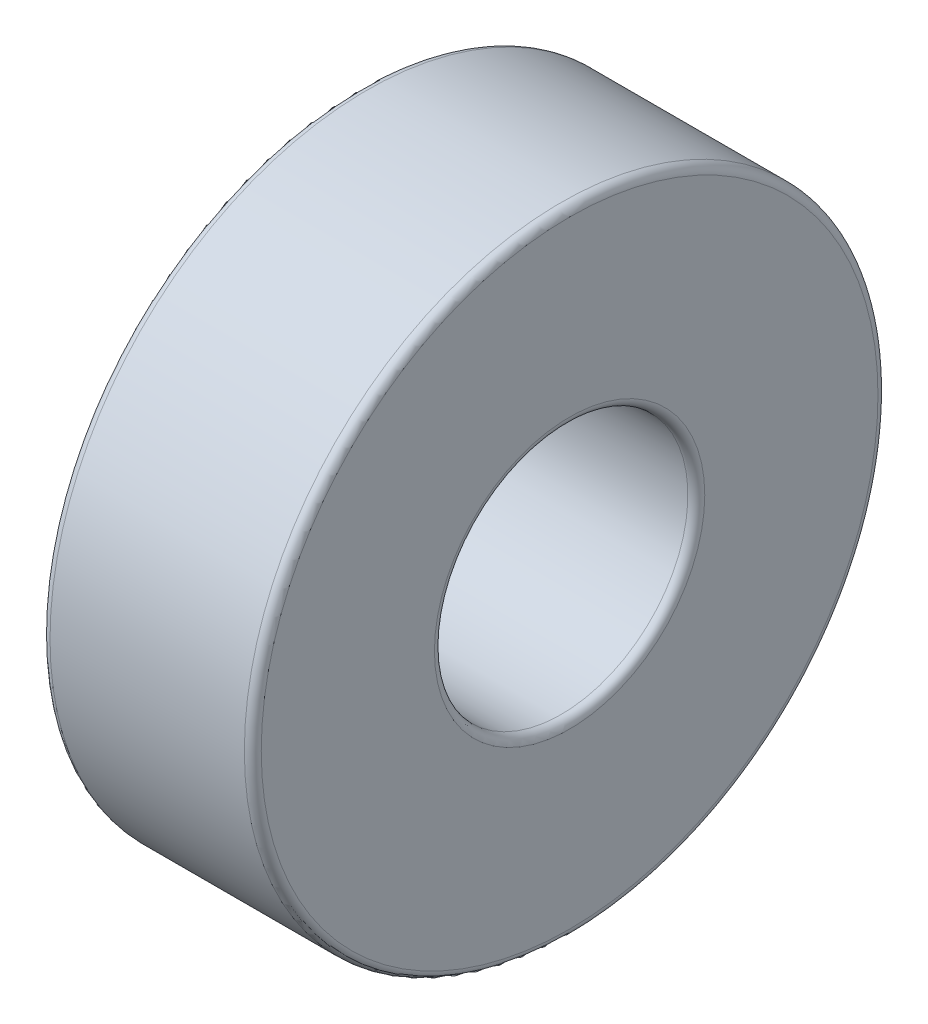
ISO-10303-21;
HEADER;
FILE_DESCRIPTION(('STEP AP214'),'2;1');
FILE_NAME('part.step','',(''),(''),'','','');
FILE_SCHEMA(('AUTOMOTIVE_DESIGN { 1 0 10303 214 1 1 1 1 }'));
ENDSEC;
DATA;
#1=APPLICATION_CONTEXT('core data for automotive mechanical design processes');
#2=APPLICATION_PROTOCOL_DEFINITION('international standard','automotive_design',2000,#1);
#3=PRODUCT_CONTEXT('',#1,'mechanical');
#4=PRODUCT('Part','Part','',(#3));
#5=PRODUCT_RELATED_PRODUCT_CATEGORY('part','',(#4));
#6=PRODUCT_DEFINITION_FORMATION('','',#4);
#7=PRODUCT_DEFINITION_CONTEXT('part definition',#1,'design');
#8=PRODUCT_DEFINITION('design','',#6,#7);
#9=PRODUCT_DEFINITION_SHAPE('','',#8);
#10=(LENGTH_UNIT() NAMED_UNIT(*) SI_UNIT(.MILLI.,.METRE.));
#11=(NAMED_UNIT(*) PLANE_ANGLE_UNIT() SI_UNIT($,.RADIAN.));
#12=(NAMED_UNIT(*) SI_UNIT($,.STERADIAN.) SOLID_ANGLE_UNIT());
#13=UNCERTAINTY_MEASURE_WITH_UNIT(LENGTH_MEASURE(1.E-05),#10,'distance_accuracy_value','');
#14=(GEOMETRIC_REPRESENTATION_CONTEXT(3) GLOBAL_UNCERTAINTY_ASSIGNED_CONTEXT((#13)) GLOBAL_UNIT_ASSIGNED_CONTEXT((#10,
#11,#12)) REPRESENTATION_CONTEXT('',''));
#15=CARTESIAN_POINT('',(0.,0.,0.));
#16=DIRECTION('',(0.,0.,1.));
#17=DIRECTION('',(1.,0.,0.));
#18=AXIS2_PLACEMENT_3D('',#15,#16,#17);
#19=CARTESIAN_POINT('',(0.2,0.,0.));
#20=DIRECTION('',(-1.,0.,0.));
#21=DIRECTION('',(0.,0.,1.));
#22=AXIS2_PLACEMENT_3D('',#19,#20,#21);
#23=CYLINDRICAL_SURFACE('',#22,3.);
#24=CARTESIAN_POINT('',(4.8,0.,0.));
#25=DIRECTION('',(-1.,0.,0.));
#26=DIRECTION('',(0.,0.,1.));
#27=AXIS2_PLACEMENT_3D('',#24,#25,#26);
#28=CIRCLE('',#27,3.);
#29=CARTESIAN_POINT('',(4.8,0.,3.));
#30=VERTEX_POINT('',#29);
#31=EDGE_CURVE('E9',#30,#30,#28,.T.);
#32=ORIENTED_EDGE('',*,*,#31,.F.);
#33=EDGE_LOOP('',(#32));
#34=FACE_BOUND('',#33,.T.);
#35=CARTESIAN_POINT('',(0.2,0.,0.));
#36=DIRECTION('',(-1.,0.,0.));
#37=DIRECTION('',(0.,0.,1.));
#38=AXIS2_PLACEMENT_3D('',#35,#36,#37);
#39=CIRCLE('',#38,3.);
#40=CARTESIAN_POINT('',(0.2,0.,3.));
#41=VERTEX_POINT('',#40);
#42=EDGE_CURVE('E83',#41,#41,#39,.T.);
#43=ORIENTED_EDGE('',*,*,#42,.T.);
#44=EDGE_LOOP('',(#43));
#45=FACE_BOUND('',#44,.T.);
#46=ADVANCED_FACE('F14',(#34,#45),#23,.F.);
#47=CARTESIAN_POINT('',(4.8,0.,0.));
#48=DIRECTION('',(-1.,0.,0.));
#49=DIRECTION('',(0.,0.,1.));
#50=AXIS2_PLACEMENT_3D('',#47,#48,#49);
#51=TOROIDAL_SURFACE('',#50,3.2,0.2);
#52=CARTESIAN_POINT('',(5.,0.,0.));
#53=DIRECTION('',(-1.,0.,0.));
#54=DIRECTION('',(0.,0.,1.));
#55=AXIS2_PLACEMENT_3D('',#52,#53,#54);
#56=CIRCLE('',#55,3.2);
#57=CARTESIAN_POINT('',(5.,0.,3.2));
#58=VERTEX_POINT('',#57);
#59=EDGE_CURVE('E23',#58,#58,#56,.T.);
#60=ORIENTED_EDGE('',*,*,#59,.F.);
#61=EDGE_LOOP('',(#60));
#62=FACE_BOUND('',#61,.T.);
#63=ORIENTED_EDGE('',*,*,#31,.T.);
#64=EDGE_LOOP('',(#63));
#65=FACE_BOUND('',#64,.T.);
#66=ADVANCED_FACE('F113',(#62,#65),#51,.T.);
#67=CARTESIAN_POINT('',(5.,3.2,0.));
#68=DIRECTION('',(-1.,0.,0.));
#69=DIRECTION('',(0.,0.,1.));
#70=AXIS2_PLACEMENT_3D('',#67,#68,#69);
#71=PLANE('',#70);
#72=CARTESIAN_POINT('',(5.,0.,0.));
#73=DIRECTION('',(-1.,0.,0.));
#74=DIRECTION('',(0.,0.,1.));
#75=AXIS2_PLACEMENT_3D('',#72,#73,#74);
#76=CIRCLE('',#75,7.3);
#77=CARTESIAN_POINT('',(5.,0.,7.3));
#78=VERTEX_POINT('',#77);
#79=EDGE_CURVE('E33',#78,#78,#76,.T.);
#80=ORIENTED_EDGE('',*,*,#79,.F.);
#81=EDGE_LOOP('',(#80));
#82=FACE_BOUND('',#81,.T.);
#83=ORIENTED_EDGE('',*,*,#59,.T.);
#84=EDGE_LOOP('',(#83));
#85=FACE_BOUND('',#84,.T.);
#86=ADVANCED_FACE('F110',(#82,#85),#71,.F.);
#87=CARTESIAN_POINT('',(4.8,0.,0.));
#88=DIRECTION('',(-1.,0.,0.));
#89=DIRECTION('',(0.,0.,1.));
#90=AXIS2_PLACEMENT_3D('',#87,#88,#89);
#91=TOROIDAL_SURFACE('',#90,7.3,0.2);
#92=CARTESIAN_POINT('',(4.8,0.,0.));
#93=DIRECTION('',(-1.,0.,0.));
#94=DIRECTION('',(0.,0.,1.));
#95=AXIS2_PLACEMENT_3D('',#92,#93,#94);
#96=CIRCLE('',#95,7.5);
#97=CARTESIAN_POINT('',(4.8,0.,7.5));
#98=VERTEX_POINT('',#97);
#99=EDGE_CURVE('E98',#98,#98,#96,.T.);
#100=ORIENTED_EDGE('',*,*,#99,.F.);
#101=EDGE_LOOP('',(#100));
#102=FACE_BOUND('',#101,.T.);
#103=ORIENTED_EDGE('',*,*,#79,.T.);
#104=EDGE_LOOP('',(#103));
#105=FACE_BOUND('',#104,.T.);
#106=ADVANCED_FACE('F108',(#102,#105),#91,.T.);
#107=CARTESIAN_POINT('',(0.2,0.,0.));
#108=DIRECTION('',(-1.,0.,0.));
#109=DIRECTION('',(0.,0.,1.));
#110=AXIS2_PLACEMENT_3D('',#107,#108,#109);
#111=CYLINDRICAL_SURFACE('',#110,7.5);
#112=CARTESIAN_POINT('',(0.2,0.,0.));
#113=DIRECTION('',(-1.,0.,0.));
#114=DIRECTION('',(0.,0.,1.));
#115=AXIS2_PLACEMENT_3D('',#112,#113,#114);
#116=CIRCLE('',#115,7.5);
#117=CARTESIAN_POINT('',(0.2,0.,7.5));
#118=VERTEX_POINT('',#117);
#119=EDGE_CURVE('E94',#118,#118,#116,.T.);
#120=ORIENTED_EDGE('',*,*,#119,.F.);
#121=EDGE_LOOP('',(#120));
#122=FACE_BOUND('',#121,.T.);
#123=ORIENTED_EDGE('',*,*,#99,.T.);
#124=EDGE_LOOP('',(#123));
#125=FACE_BOUND('',#124,.T.);
#126=ADVANCED_FACE('F126',(#122,#125),#111,.T.);
#127=CARTESIAN_POINT('',(0.2,0.,0.));
#128=DIRECTION('',(-1.,0.,0.));
#129=DIRECTION('',(0.,0.,1.));
#130=AXIS2_PLACEMENT_3D('',#127,#128,#129);
#131=TOROIDAL_SURFACE('',#130,7.3,0.2);
#132=CARTESIAN_POINT('',(0.,0.,0.));
#133=DIRECTION('',(-1.,0.,0.));
#134=DIRECTION('',(0.,0.,1.));
#135=AXIS2_PLACEMENT_3D('',#132,#133,#134);
#136=CIRCLE('',#135,7.3);
#137=CARTESIAN_POINT('',(0.,0.,7.3));
#138=VERTEX_POINT('',#137);
#139=EDGE_CURVE('E90',#138,#138,#136,.T.);
#140=ORIENTED_EDGE('',*,*,#139,.F.);
#141=EDGE_LOOP('',(#140));
#142=FACE_BOUND('',#141,.T.);
#143=ORIENTED_EDGE('',*,*,#119,.T.);
#144=EDGE_LOOP('',(#143));
#145=FACE_BOUND('',#144,.T.);
#146=ADVANCED_FACE('F130',(#142,#145),#131,.T.);
#147=CARTESIAN_POINT('',(0.,3.2,0.));
#148=DIRECTION('',(-1.,0.,0.));
#149=DIRECTION('',(0.,0.,1.));
#150=AXIS2_PLACEMENT_3D('',#147,#148,#149);
#151=PLANE('',#150);
#152=ORIENTED_EDGE('',*,*,#139,.T.);
#153=EDGE_LOOP('',(#152));
#154=FACE_BOUND('',#153,.T.);
#155=CARTESIAN_POINT('',(0.,0.,0.));
#156=DIRECTION('',(-1.,0.,0.));
#157=DIRECTION('',(0.,0.,1.));
#158=AXIS2_PLACEMENT_3D('',#155,#156,#157);
#159=CIRCLE('',#158,3.2);
#160=CARTESIAN_POINT('',(0.,0.,3.2));
#161=VERTEX_POINT('',#160);
#162=EDGE_CURVE('E86',#161,#161,#159,.T.);
#163=ORIENTED_EDGE('',*,*,#162,.F.);
#164=EDGE_LOOP('',(#163));
#165=FACE_BOUND('',#164,.T.);
#166=ADVANCED_FACE('F134',(#154,#165),#151,.T.);
#167=CARTESIAN_POINT('',(0.2,0.,0.));
#168=DIRECTION('',(-1.,0.,0.));
#169=DIRECTION('',(0.,0.,1.));
#170=AXIS2_PLACEMENT_3D('',#167,#168,#169);
#171=TOROIDAL_SURFACE('',#170,3.2,0.2);
#172=ORIENTED_EDGE('',*,*,#42,.F.);
#173=EDGE_LOOP('',(#172));
#174=FACE_BOUND('',#173,.T.);
#175=ORIENTED_EDGE('',*,*,#162,.T.);
#176=EDGE_LOOP('',(#175));
#177=FACE_BOUND('',#176,.T.);
#178=ADVANCED_FACE('F138',(#174,#177),#171,.T.);
#179=CLOSED_SHELL('',(#46,#66,#86,#106,#126,#146,#166,#178));
#180=CARTESIAN_POINT('',(0.9375,0.,0.));
#181=DIRECTION('',(-1.,0.,0.));
#182=DIRECTION('',(0.,0.,-1.));
#183=AXIS2_PLACEMENT_3D('',#180,#181,#182);
#184=CYLINDRICAL_SURFACE('',#183,5.16);
#185=CARTESIAN_POINT('',(2.41,0.,0.));
#186=DIRECTION('',(-1.,0.,0.));
#187=DIRECTION('',(0.,-1.,0.));
#188=AXIS2_PLACEMENT_3D('',#185,#186,#187);
#189=CIRCLE('',#188,5.16);
#190=CARTESIAN_POINT('',(2.41,-5.16,0.));
#191=VERTEX_POINT('',#190);
#192=EDGE_CURVE('E63',#191,#191,#189,.T.);
#193=ORIENTED_EDGE('',*,*,#192,.T.);
#194=EDGE_LOOP('',(#193));
#195=FACE_BOUND('',#194,.T.);
#196=CARTESIAN_POINT('',(0.9375,0.,0.));
#197=DIRECTION('',(-1.,0.,0.));
#198=DIRECTION('',(0.,0.,-1.));
#199=AXIS2_PLACEMENT_3D('',#196,#197,#198);
#200=CIRCLE('',#199,5.16);
#201=CARTESIAN_POINT('',(0.9375,0.,-5.16));
#202=VERTEX_POINT('',#201);
#203=EDGE_CURVE('E79',#202,#202,#200,.T.);
#204=ORIENTED_EDGE('',*,*,#203,.F.);
#205=EDGE_LOOP('',(#204));
#206=FACE_BOUND('',#205,.T.);
#207=ADVANCED_FACE('F149',(#195,#206),#184,.T.);
#208=CARTESIAN_POINT('',(0.9375,0.,0.));
#209=DIRECTION('',(-1.,0.,0.));
#210=DIRECTION('',(0.,0.,-1.));
#211=AXIS2_PLACEMENT_3D('',#208,#209,#210);
#212=CYLINDRICAL_SURFACE('',#211,5.34);
#213=CARTESIAN_POINT('',(2.41,0.,0.));
#214=DIRECTION('',(-1.,0.,0.));
#215=DIRECTION('',(0.,-1.,0.));
#216=AXIS2_PLACEMENT_3D('',#213,#214,#215);
#217=CIRCLE('',#216,5.34);
#218=CARTESIAN_POINT('',(2.41,-5.34,0.));
#219=VERTEX_POINT('',#218);
#220=EDGE_CURVE('E17',#219,#219,#217,.F.);
#221=ORIENTED_EDGE('',*,*,#220,.T.);
#222=EDGE_LOOP('',(#221));
#223=FACE_BOUND('',#222,.T.);
#224=CARTESIAN_POINT('',(0.9375,0.,0.));
#225=DIRECTION('',(-1.,0.,0.));
#226=DIRECTION('',(0.,0.,-1.));
#227=AXIS2_PLACEMENT_3D('',#224,#225,#226);
#228=CIRCLE('',#227,5.34);
#229=CARTESIAN_POINT('',(0.9375,0.,-5.34));
#230=VERTEX_POINT('',#229);
#231=EDGE_CURVE('E75',#230,#230,#228,.T.);
#232=ORIENTED_EDGE('',*,*,#231,.T.);
#233=EDGE_LOOP('',(#232));
#234=FACE_BOUND('',#233,.T.);
#235=ADVANCED_FACE('F155',(#223,#234),#212,.F.);
#236=CARTESIAN_POINT('',(0.9375,-5.16,0.));
#237=DIRECTION('',(-1.,0.,0.));
#238=DIRECTION('',(0.,0.,-1.));
#239=AXIS2_PLACEMENT_3D('',#236,#237,#238);
#240=PLANE('',#239);
#241=ORIENTED_EDGE('',*,*,#231,.F.);
#242=EDGE_LOOP('',(#241));
#243=FACE_BOUND('',#242,.T.);
#244=ORIENTED_EDGE('',*,*,#203,.T.);
#245=EDGE_LOOP('',(#244));
#246=FACE_BOUND('',#245,.T.);
#247=ADVANCED_FACE('F151',(#243,#246),#240,.F.);
#248=CARTESIAN_POINT('',(2.41,-4.5,0.));
#249=DIRECTION('',(-1.,0.,0.));
#250=DIRECTION('',(0.,0.,-1.));
#251=AXIS2_PLACEMENT_3D('',#248,#249,#250);
#252=PLANE('',#251);
#253=CARTESIAN_POINT('',(2.41,0.,0.));
#254=DIRECTION('',(-1.,0.,0.));
#255=DIRECTION('',(0.,0.,-1.));
#256=AXIS2_PLACEMENT_3D('',#253,#254,#255);
#257=CIRCLE('',#256,6.);
#258=CARTESIAN_POINT('',(2.41,0.,-6.));
#259=VERTEX_POINT('',#258);
#260=EDGE_CURVE('E51',#259,#259,#257,.T.);
#261=ORIENTED_EDGE('',*,*,#260,.F.);
#262=EDGE_LOOP('',(#261));
#263=FACE_BOUND('',#262,.T.);
#264=ORIENTED_EDGE('',*,*,#220,.F.);
#265=EDGE_LOOP('',(#264));
#266=FACE_BOUND('',#265,.T.);
#267=ADVANCED_FACE('F154',(#263,#266),#252,.F.);
#268=CARTESIAN_POINT('',(2.41,0.,0.));
#269=DIRECTION('',(-1.,0.,0.));
#270=DIRECTION('',(0.,0.,-1.));
#271=AXIS2_PLACEMENT_3D('',#268,#269,#270);
#272=CYLINDRICAL_SURFACE('',#271,6.);
#273=CARTESIAN_POINT('',(2.59,0.,0.));
#274=DIRECTION('',(-1.,0.,0.));
#275=DIRECTION('',(0.,0.,-1.));
#276=AXIS2_PLACEMENT_3D('',#273,#274,#275);
#277=CIRCLE('',#276,6.);
#278=CARTESIAN_POINT('',(2.59,0.,-6.));
#279=VERTEX_POINT('',#278);
#280=EDGE_CURVE('E59',#279,#279,#277,.T.);
#281=ORIENTED_EDGE('',*,*,#280,.F.);
#282=EDGE_LOOP('',(#281));
#283=FACE_BOUND('',#282,.T.);
#284=ORIENTED_EDGE('',*,*,#260,.T.);
#285=EDGE_LOOP('',(#284));
#286=FACE_BOUND('',#285,.T.);
#287=ADVANCED_FACE('F171',(#283,#286),#272,.F.);
#288=CARTESIAN_POINT('',(2.59,-6.,0.));
#289=DIRECTION('',(1.,0.,0.));
#290=DIRECTION('',(0.,0.,1.));
#291=AXIS2_PLACEMENT_3D('',#288,#289,#290);
#292=PLANE('',#291);
#293=ORIENTED_EDGE('',*,*,#280,.T.);
#294=EDGE_LOOP('',(#293));
#295=FACE_BOUND('',#294,.T.);
#296=CARTESIAN_POINT('',(2.59,0.,0.));
#297=DIRECTION('',(1.,0.,0.));
#298=DIRECTION('',(0.,1.,0.));
#299=AXIS2_PLACEMENT_3D('',#296,#297,#298);
#300=CIRCLE('',#299,5.34);
#301=CARTESIAN_POINT('',(2.59,5.34,0.));
#302=VERTEX_POINT('',#301);
#303=EDGE_CURVE('E36',#302,#302,#300,.F.);
#304=ORIENTED_EDGE('',*,*,#303,.F.);
#305=EDGE_LOOP('',(#304));
#306=FACE_BOUND('',#305,.T.);
#307=ADVANCED_FACE('F170',(#295,#306),#292,.F.);
#308=CARTESIAN_POINT('',(2.41,0.,0.));
#309=DIRECTION('',(-1.,0.,0.));
#310=DIRECTION('',(0.,0.,-1.));
#311=AXIS2_PLACEMENT_3D('',#308,#309,#310);
#312=CIRCLE('',#311,4.5);
#313=CARTESIAN_POINT('',(2.41,0.,-4.5));
#314=VERTEX_POINT('',#313);
#315=EDGE_CURVE('E40',#314,#314,#312,.T.);
#316=ORIENTED_EDGE('',*,*,#315,.T.);
#317=EDGE_LOOP('',(#316));
#318=FACE_BOUND('',#317,.T.);
#319=ORIENTED_EDGE('',*,*,#192,.F.);
#320=EDGE_LOOP('',(#319));
#321=FACE_BOUND('',#320,.T.);
#322=ADVANCED_FACE('F167',(#318,#321),#252,.F.);
#323=CARTESIAN_POINT('',(2.59,0.,0.));
#324=DIRECTION('',(-1.,0.,0.));
#325=DIRECTION('',(0.,0.,-1.));
#326=AXIS2_PLACEMENT_3D('',#323,#324,#325);
#327=CIRCLE('',#326,4.5);
#328=CARTESIAN_POINT('',(2.59,0.,-4.5));
#329=VERTEX_POINT('',#328);
#330=EDGE_CURVE('E231',#329,#329,#327,.T.);
#331=ORIENTED_EDGE('',*,*,#330,.F.);
#332=EDGE_LOOP('',(#331));
#333=FACE_BOUND('',#332,.T.);
#334=CARTESIAN_POINT('',(2.59,0.,0.));
#335=DIRECTION('',(1.,0.,0.));
#336=DIRECTION('',(0.,1.,0.));
#337=AXIS2_PLACEMENT_3D('',#334,#335,#336);
#338=CIRCLE('',#337,5.16);
#339=CARTESIAN_POINT('',(2.59,5.16,0.));
#340=VERTEX_POINT('',#339);
#341=EDGE_CURVE('E39',#340,#340,#338,.T.);
#342=ORIENTED_EDGE('',*,*,#341,.F.);
#343=EDGE_LOOP('',(#342));
#344=FACE_BOUND('',#343,.T.);
#345=ADVANCED_FACE('F165',(#333,#344),#292,.F.);
#346=CARTESIAN_POINT('',(2.41,0.,0.));
#347=DIRECTION('',(-1.,0.,0.));
#348=DIRECTION('',(0.,0.,-1.));
#349=AXIS2_PLACEMENT_3D('',#346,#347,#348);
#350=CYLINDRICAL_SURFACE('',#349,4.5);
#351=ORIENTED_EDGE('',*,*,#315,.F.);
#352=EDGE_LOOP('',(#351));
#353=FACE_BOUND('',#352,.T.);
#354=ORIENTED_EDGE('',*,*,#330,.T.);
#355=EDGE_LOOP('',(#354));
#356=FACE_BOUND('',#355,.T.);
#357=ADVANCED_FACE('F147',(#353,#356),#350,.T.);
#358=ORIENTED_EDGE('',*,*,#341,.T.);
#359=EDGE_LOOP('',(#358));
#360=FACE_BOUND('',#359,.T.);
#361=CARTESIAN_POINT('',(4.0625,0.,0.));
#362=DIRECTION('',(-1.,0.,0.));
#363=DIRECTION('',(0.,0.,-1.));
#364=AXIS2_PLACEMENT_3D('',#361,#362,#363);
#365=CIRCLE('',#364,5.16);
#366=CARTESIAN_POINT('',(4.0625,0.,-5.16));
#367=VERTEX_POINT('',#366);
#368=EDGE_CURVE('E67',#367,#367,#365,.T.);
#369=ORIENTED_EDGE('',*,*,#368,.T.);
#370=EDGE_LOOP('',(#369));
#371=FACE_BOUND('',#370,.T.);
#372=ADVANCED_FACE('F143',(#360,#371),#184,.T.);
#373=CARTESIAN_POINT('',(4.0625,-5.34,0.));
#374=DIRECTION('',(1.,0.,0.));
#375=DIRECTION('',(0.,0.,1.));
#376=AXIS2_PLACEMENT_3D('',#373,#374,#375);
#377=PLANE('',#376);
#378=ORIENTED_EDGE('',*,*,#368,.F.);
#379=EDGE_LOOP('',(#378));
#380=FACE_BOUND('',#379,.T.);
#381=CARTESIAN_POINT('',(4.0625,0.,0.));
#382=DIRECTION('',(-1.,0.,0.));
#383=DIRECTION('',(0.,0.,-1.));
#384=AXIS2_PLACEMENT_3D('',#381,#382,#383);
#385=CIRCLE('',#384,5.34);
#386=CARTESIAN_POINT('',(4.0625,0.,-5.34));
#387=VERTEX_POINT('',#386);
#388=EDGE_CURVE('E71',#387,#387,#385,.T.);
#389=ORIENTED_EDGE('',*,*,#388,.T.);
#390=EDGE_LOOP('',(#389));
#391=FACE_BOUND('',#390,.T.);
#392=ADVANCED_FACE('F146',(#380,#391),#377,.F.);
#393=ORIENTED_EDGE('',*,*,#303,.T.);
#394=EDGE_LOOP('',(#393));
#395=FACE_BOUND('',#394,.T.);
#396=ORIENTED_EDGE('',*,*,#388,.F.);
#397=EDGE_LOOP('',(#396));
#398=FACE_BOUND('',#397,.T.);
#399=ADVANCED_FACE('F157',(#395,#398),#212,.F.);
#400=CLOSED_SHELL('',(#207,#235,#247,#267,#287,#307,#322,#345,#357,#372,#392,#399));
#401=ORIENTED_CLOSED_SHELL('',*,#400,.T.);
#402=BREP_WITH_VOIDS('B1',#179,(#401));
#403=ADVANCED_BREP_SHAPE_REPRESENTATION('',(#18,#402),#14);
#404=SHAPE_DEFINITION_REPRESENTATION(#9,#403);
ENDSEC;
END-ISO-10303-21;
